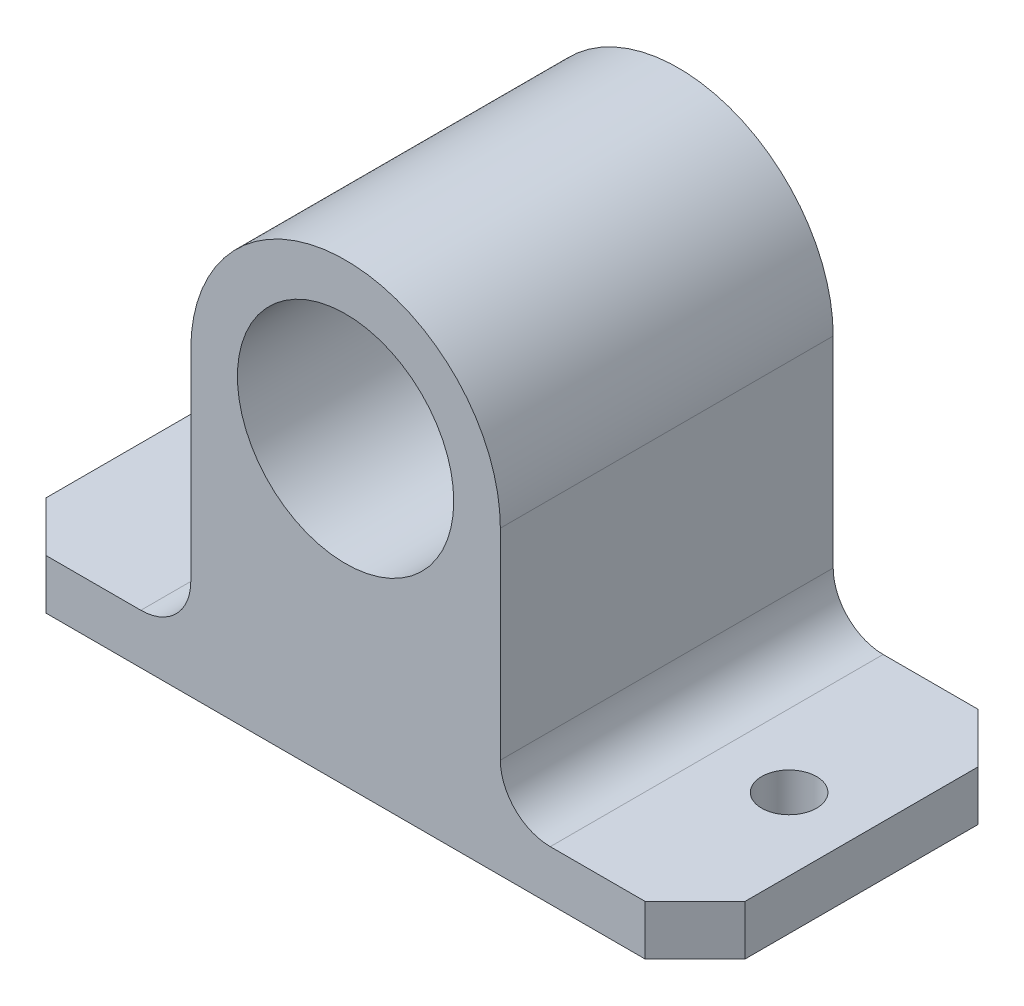
ISO-10303-21;
HEADER;
FILE_DESCRIPTION(('STEP AP214'),'2;1');
FILE_NAME('part.step','',(''),(''),'','','');
FILE_SCHEMA(('AUTOMOTIVE_DESIGN { 1 0 10303 214 1 1 1 1 }'));
ENDSEC;
DATA;
#1=APPLICATION_CONTEXT('core data for automotive mechanical design processes');
#2=APPLICATION_PROTOCOL_DEFINITION('international standard','automotive_design',2000,#1);
#3=PRODUCT_CONTEXT('',#1,'mechanical');
#4=PRODUCT('Part','Part','',(#3));
#5=PRODUCT_RELATED_PRODUCT_CATEGORY('part','',(#4));
#6=PRODUCT_DEFINITION_FORMATION('','',#4);
#7=PRODUCT_DEFINITION_CONTEXT('part definition',#1,'design');
#8=PRODUCT_DEFINITION('design','',#6,#7);
#9=PRODUCT_DEFINITION_SHAPE('','',#8);
#10=(LENGTH_UNIT() NAMED_UNIT(*) SI_UNIT(.MILLI.,.METRE.));
#11=(NAMED_UNIT(*) PLANE_ANGLE_UNIT() SI_UNIT($,.RADIAN.));
#12=(NAMED_UNIT(*) SI_UNIT($,.STERADIAN.) SOLID_ANGLE_UNIT());
#13=UNCERTAINTY_MEASURE_WITH_UNIT(LENGTH_MEASURE(1.E-05),#10,'distance_accuracy_value','');
#14=(GEOMETRIC_REPRESENTATION_CONTEXT(3) GLOBAL_UNCERTAINTY_ASSIGNED_CONTEXT((#13)) GLOBAL_UNIT_ASSIGNED_CONTEXT((#10,
#11,#12)) REPRESENTATION_CONTEXT('',''));
#15=CARTESIAN_POINT('',(0.,0.,0.));
#16=DIRECTION('',(0.,0.,1.));
#17=DIRECTION('',(1.,0.,0.));
#18=AXIS2_PLACEMENT_3D('',#15,#16,#17);
#19=CARTESIAN_POINT('',(-12.3,-12.0723673279713,20.));
#20=DIRECTION('',(0.,0.,-1.));
#21=DIRECTION('',(-1.,0.,0.));
#22=AXIS2_PLACEMENT_3D('',#19,#20,#21);
#23=PLANE('',#22);
#24=DIRECTION('',(-1.,0.,0.));
#25=VECTOR('',#24,1.);
#26=CARTESIAN_POINT('',(-21.,-15.0723673279713,20.));
#27=LINE('',#26,#25);
#28=CARTESIAN_POINT('',(-12.3,-15.0723673279713,20.));
#29=VERTEX_POINT('',#28);
#30=CARTESIAN_POINT('',(-18.,-15.0723673279713,20.));
#31=VERTEX_POINT('',#30);
#32=EDGE_CURVE('E185',#29,#31,#27,.T.);
#33=ORIENTED_EDGE('',*,*,#32,.T.);
#34=DIRECTION('',(0.,-1.,0.));
#35=VECTOR('',#34,1.);
#36=CARTESIAN_POINT('',(-18.,-12.0723673279713,20.));
#37=LINE('',#36,#35);
#38=CARTESIAN_POINT('',(-18.,-18.0723673279713,20.));
#39=VERTEX_POINT('',#38);
#40=EDGE_CURVE('E248',#31,#39,#37,.T.);
#41=ORIENTED_EDGE('',*,*,#40,.T.);
#42=DIRECTION('',(1.,0.,0.));
#43=VECTOR('',#42,1.);
#44=CARTESIAN_POINT('',(-21.,-18.0723673279713,20.));
#45=LINE('',#44,#43);
#46=CARTESIAN_POINT('',(18.,-18.0723673279713,20.));
#47=VERTEX_POINT('',#46);
#48=EDGE_CURVE('E153',#39,#47,#45,.T.);
#49=ORIENTED_EDGE('',*,*,#48,.T.);
#50=DIRECTION('',(0.,1.,0.));
#51=VECTOR('',#50,1.);
#52=CARTESIAN_POINT('',(18.,-12.0723673279713,20.));
#53=LINE('',#52,#51);
#54=CARTESIAN_POINT('',(18.,-15.0723673279713,20.));
#55=VERTEX_POINT('',#54);
#56=EDGE_CURVE('E151',#47,#55,#53,.T.);
#57=ORIENTED_EDGE('',*,*,#56,.T.);
#58=DIRECTION('',(-1.,0.,0.));
#59=VECTOR('',#58,1.);
#60=CARTESIAN_POINT('',(12.3,-15.0723673279713,20.));
#61=LINE('',#60,#59);
#62=CARTESIAN_POINT('',(12.3,-15.0723673279713,20.));
#63=VERTEX_POINT('',#62);
#64=EDGE_CURVE('E142',#55,#63,#61,.T.);
#65=ORIENTED_EDGE('',*,*,#64,.T.);
#66=CARTESIAN_POINT('',(12.3,-12.0723673279713,20.));
#67=DIRECTION('',(0.,0.,-1.));
#68=DIRECTION('',(-1.,0.,0.));
#69=AXIS2_PLACEMENT_3D('',#66,#67,#68);
#70=CIRCLE('',#69,3.);
#71=CARTESIAN_POINT('',(9.3,-12.0723673279713,20.));
#72=VERTEX_POINT('',#71);
#73=EDGE_CURVE('E147',#63,#72,#70,.T.);
#74=ORIENTED_EDGE('',*,*,#73,.T.);
#75=DIRECTION('',(0.,1.,0.));
#76=VECTOR('',#75,1.);
#77=CARTESIAN_POINT('',(9.3,0.,20.));
#78=LINE('',#77,#76);
#79=CARTESIAN_POINT('',(9.3,0.,20.));
#80=VERTEX_POINT('',#79);
#81=EDGE_CURVE('E170',#72,#80,#78,.T.);
#82=ORIENTED_EDGE('',*,*,#81,.T.);
#83=CARTESIAN_POINT('',(0.,0.,20.));
#84=DIRECTION('',(0.,0.,1.));
#85=DIRECTION('',(1.,0.,0.));
#86=AXIS2_PLACEMENT_3D('',#83,#84,#85);
#87=CIRCLE('',#86,9.3);
#88=CARTESIAN_POINT('',(-9.3,0.,20.));
#89=VERTEX_POINT('',#88);
#90=EDGE_CURVE('E173',#80,#89,#87,.T.);
#91=ORIENTED_EDGE('',*,*,#90,.T.);
#92=DIRECTION('',(0.,-1.,0.));
#93=VECTOR('',#92,1.);
#94=CARTESIAN_POINT('',(-9.3,0.,20.));
#95=LINE('',#94,#93);
#96=CARTESIAN_POINT('',(-9.3,-12.0723673279713,20.));
#97=VERTEX_POINT('',#96);
#98=EDGE_CURVE('E179',#89,#97,#95,.T.);
#99=ORIENTED_EDGE('',*,*,#98,.T.);
#100=CARTESIAN_POINT('',(-12.3,-12.0723673279713,20.));
#101=DIRECTION('',(0.,0.,-1.));
#102=DIRECTION('',(-1.,0.,0.));
#103=AXIS2_PLACEMENT_3D('',#100,#101,#102);
#104=CIRCLE('',#103,3.);
#105=EDGE_CURVE('E182',#97,#29,#104,.T.);
#106=ORIENTED_EDGE('',*,*,#105,.T.);
#107=EDGE_LOOP('',(#33,#41,#49,#57,#65,#74,#82,#91,#99,#106));
#108=FACE_BOUND('',#107,.T.);
#109=CARTESIAN_POINT('',(0.,0.,20.));
#110=DIRECTION('',(0.,0.,1.));
#111=DIRECTION('',(1.,0.,0.));
#112=AXIS2_PLACEMENT_3D('',#109,#110,#111);
#113=CIRCLE('',#112,6.5);
#114=CARTESIAN_POINT('',(6.5,0.,20.));
#115=VERTEX_POINT('',#114);
#116=EDGE_CURVE('E193',#115,#115,#113,.T.);
#117=ORIENTED_EDGE('',*,*,#116,.F.);
#118=EDGE_LOOP('',(#117));
#119=FACE_BOUND('',#118,.T.);
#120=ADVANCED_FACE('F41',(#108,#119),#23,.F.);
#121=CARTESIAN_POINT('',(-12.3,-12.0723673279713,0.));
#122=DIRECTION('',(0.,0.,-1.));
#123=DIRECTION('',(-1.,0.,0.));
#124=AXIS2_PLACEMENT_3D('',#121,#122,#123);
#125=PLANE('',#124);
#126=DIRECTION('',(1.,0.,0.));
#127=VECTOR('',#126,1.);
#128=CARTESIAN_POINT('',(-21.,-18.0723673279713,0.));
#129=LINE('',#128,#127);
#130=CARTESIAN_POINT('',(-18.,-18.0723673279713,0.));
#131=VERTEX_POINT('',#130);
#132=CARTESIAN_POINT('',(18.,-18.0723673279713,0.));
#133=VERTEX_POINT('',#132);
#134=EDGE_CURVE('E189',#131,#133,#129,.T.);
#135=ORIENTED_EDGE('',*,*,#134,.F.);
#136=DIRECTION('',(0.,1.,0.));
#137=VECTOR('',#136,1.);
#138=CARTESIAN_POINT('',(-18.,-15.0723673279713,0.));
#139=LINE('',#138,#137);
#140=CARTESIAN_POINT('',(-18.,-15.0723673279713,0.));
#141=VERTEX_POINT('',#140);
#142=EDGE_CURVE('E280',#131,#141,#139,.T.);
#143=ORIENTED_EDGE('',*,*,#142,.T.);
#144=DIRECTION('',(-1.,0.,0.));
#145=VECTOR('',#144,1.);
#146=CARTESIAN_POINT('',(-21.,-15.0723673279713,0.));
#147=LINE('',#146,#145);
#148=CARTESIAN_POINT('',(-12.3,-15.0723673279713,0.));
#149=VERTEX_POINT('',#148);
#150=EDGE_CURVE('E211',#149,#141,#147,.T.);
#151=ORIENTED_EDGE('',*,*,#150,.F.);
#152=CARTESIAN_POINT('',(-12.3,-12.0723673279713,0.));
#153=DIRECTION('',(0.,0.,-1.));
#154=DIRECTION('',(-1.,0.,0.));
#155=AXIS2_PLACEMENT_3D('',#152,#153,#154);
#156=CIRCLE('',#155,3.);
#157=CARTESIAN_POINT('',(-9.3,-12.0723673279713,0.));
#158=VERTEX_POINT('',#157);
#159=EDGE_CURVE('E208',#158,#149,#156,.T.);
#160=ORIENTED_EDGE('',*,*,#159,.F.);
#161=DIRECTION('',(0.,-1.,0.));
#162=VECTOR('',#161,1.);
#163=CARTESIAN_POINT('',(-9.3,0.,0.));
#164=LINE('',#163,#162);
#165=CARTESIAN_POINT('',(-9.3,0.,0.));
#166=VERTEX_POINT('',#165);
#167=EDGE_CURVE('E205',#166,#158,#164,.T.);
#168=ORIENTED_EDGE('',*,*,#167,.F.);
#169=CARTESIAN_POINT('',(0.,0.,0.));
#170=DIRECTION('',(0.,0.,1.));
#171=DIRECTION('',(1.,0.,0.));
#172=AXIS2_PLACEMENT_3D('',#169,#170,#171);
#173=CIRCLE('',#172,9.3);
#174=CARTESIAN_POINT('',(9.3,0.,0.));
#175=VERTEX_POINT('',#174);
#176=EDGE_CURVE('E202',#175,#166,#173,.T.);
#177=ORIENTED_EDGE('',*,*,#176,.F.);
#178=DIRECTION('',(0.,1.,0.));
#179=VECTOR('',#178,1.);
#180=CARTESIAN_POINT('',(9.3,0.,0.));
#181=LINE('',#180,#179);
#182=CARTESIAN_POINT('',(9.3,-12.0723673279713,0.));
#183=VERTEX_POINT('',#182);
#184=EDGE_CURVE('E199',#183,#175,#181,.T.);
#185=ORIENTED_EDGE('',*,*,#184,.F.);
#186=CARTESIAN_POINT('',(12.3,-12.0723673279713,0.));
#187=DIRECTION('',(0.,0.,-1.));
#188=DIRECTION('',(-1.,0.,0.));
#189=AXIS2_PLACEMENT_3D('',#186,#187,#188);
#190=CIRCLE('',#189,3.);
#191=CARTESIAN_POINT('',(12.3,-15.0723673279713,0.));
#192=VERTEX_POINT('',#191);
#193=EDGE_CURVE('E196',#192,#183,#190,.T.);
#194=ORIENTED_EDGE('',*,*,#193,.F.);
#195=DIRECTION('',(-1.,0.,0.));
#196=VECTOR('',#195,1.);
#197=CARTESIAN_POINT('',(12.3,-15.0723673279713,0.));
#198=LINE('',#197,#196);
#199=CARTESIAN_POINT('',(18.,-15.0723673279713,0.));
#200=VERTEX_POINT('',#199);
#201=EDGE_CURVE('E159',#200,#192,#198,.T.);
#202=ORIENTED_EDGE('',*,*,#201,.F.);
#203=DIRECTION('',(0.,-1.,0.));
#204=VECTOR('',#203,1.);
#205=CARTESIAN_POINT('',(18.,-18.0723673279713,0.));
#206=LINE('',#205,#204);
#207=EDGE_CURVE('E277',#200,#133,#206,.T.);
#208=ORIENTED_EDGE('',*,*,#207,.T.);
#209=EDGE_LOOP('',(#135,#143,#151,#160,#168,#177,#185,#194,#202,#208));
#210=FACE_BOUND('',#209,.T.);
#211=CARTESIAN_POINT('',(0.,0.,0.));
#212=DIRECTION('',(0.,0.,1.));
#213=DIRECTION('',(1.,0.,0.));
#214=AXIS2_PLACEMENT_3D('',#211,#212,#213);
#215=CIRCLE('',#214,6.5);
#216=CARTESIAN_POINT('',(6.5,0.,0.));
#217=VERTEX_POINT('',#216);
#218=EDGE_CURVE('E524',#217,#217,#215,.T.);
#219=ORIENTED_EDGE('',*,*,#218,.T.);
#220=EDGE_LOOP('',(#219));
#221=FACE_BOUND('',#220,.T.);
#222=ADVANCED_FACE('F296',(#210,#221),#125,.T.);
#223=CARTESIAN_POINT('',(-21.,-18.0723673279713,20.));
#224=DIRECTION('',(1.,0.,0.));
#225=DIRECTION('',(0.,0.,-1.));
#226=AXIS2_PLACEMENT_3D('',#223,#224,#225);
#227=PLANE('',#226);
#228=DIRECTION('',(0.,0.,-1.));
#229=VECTOR('',#228,1.);
#230=CARTESIAN_POINT('',(-21.,-18.0723673279713,20.));
#231=LINE('',#230,#229);
#232=CARTESIAN_POINT('',(-21.,-18.0723673279713,17.));
#233=VERTEX_POINT('',#232);
#234=CARTESIAN_POINT('',(-21.,-18.0723673279713,3.));
#235=VERTEX_POINT('',#234);
#236=EDGE_CURVE('E242',#233,#235,#231,.T.);
#237=ORIENTED_EDGE('',*,*,#236,.F.);
#238=DIRECTION('',(0.,1.,0.));
#239=VECTOR('',#238,1.);
#240=CARTESIAN_POINT('',(-21.,-18.0723673279713,17.));
#241=LINE('',#240,#239);
#242=CARTESIAN_POINT('',(-21.,-15.0723673279713,17.));
#243=VERTEX_POINT('',#242);
#244=EDGE_CURVE('E268',#233,#243,#241,.T.);
#245=ORIENTED_EDGE('',*,*,#244,.T.);
#246=DIRECTION('',(0.,0.,-1.));
#247=VECTOR('',#246,1.);
#248=CARTESIAN_POINT('',(-21.,-15.0723673279713,20.));
#249=LINE('',#248,#247);
#250=CARTESIAN_POINT('',(-21.,-15.0723673279713,3.));
#251=VERTEX_POINT('',#250);
#252=EDGE_CURVE('E188',#243,#251,#249,.T.);
#253=ORIENTED_EDGE('',*,*,#252,.T.);
#254=DIRECTION('',(0.,-1.,0.));
#255=VECTOR('',#254,1.);
#256=CARTESIAN_POINT('',(-21.,-18.0723673279713,3.));
#257=LINE('',#256,#255);
#258=EDGE_CURVE('E264',#251,#235,#257,.T.);
#259=ORIENTED_EDGE('',*,*,#258,.T.);
#260=EDGE_LOOP('',(#237,#245,#253,#259));
#261=FACE_BOUND('',#260,.T.);
#262=ADVANCED_FACE('F316',(#261),#227,.F.);
#263=CARTESIAN_POINT('',(-21.,-18.0723673279713,20.));
#264=DIRECTION('',(0.,1.,0.));
#265=DIRECTION('',(-1.,0.,0.));
#266=AXIS2_PLACEMENT_3D('',#263,#264,#265);
#267=PLANE('',#266);
#268=CARTESIAN_POINT('',(16.65,-18.0723673279713,10.));
#269=DIRECTION('',(0.,1.,0.));
#270=DIRECTION('',(-1.,0.,0.));
#271=AXIS2_PLACEMENT_3D('',#268,#269,#270);
#272=CIRCLE('',#271,1.65);
#273=CARTESIAN_POINT('',(15.,-18.0723673279713,10.));
#274=VERTEX_POINT('',#273);
#275=EDGE_CURVE('E514',#274,#274,#272,.T.);
#276=ORIENTED_EDGE('',*,*,#275,.T.);
#277=EDGE_LOOP('',(#276));
#278=FACE_BOUND('',#277,.T.);
#279=CARTESIAN_POINT('',(-16.65,-18.0723673279713,10.));
#280=DIRECTION('',(0.,1.,0.));
#281=DIRECTION('',(-1.,0.,0.));
#282=AXIS2_PLACEMENT_3D('',#279,#280,#281);
#283=CIRCLE('',#282,1.65);
#284=CARTESIAN_POINT('',(-18.3,-18.0723673279713,10.));
#285=VERTEX_POINT('',#284);
#286=EDGE_CURVE('E517',#285,#285,#283,.T.);
#287=ORIENTED_EDGE('',*,*,#286,.T.);
#288=EDGE_LOOP('',(#287));
#289=FACE_BOUND('',#288,.T.);
#290=ORIENTED_EDGE('',*,*,#48,.F.);
#291=DIRECTION('',(0.707106781186546,0.,0.707106781186549));
#292=VECTOR('',#291,1.);
#293=CARTESIAN_POINT('',(-18.,-18.0723673279713,20.));
#294=LINE('',#293,#292);
#295=EDGE_CURVE('E261',#39,#233,#294,.F.);
#296=ORIENTED_EDGE('',*,*,#295,.T.);
#297=ORIENTED_EDGE('',*,*,#236,.T.);
#298=DIRECTION('',(0.707106781186549,0.,-0.707106781186546));
#299=VECTOR('',#298,1.);
#300=CARTESIAN_POINT('',(-21.,-18.0723673279713,3.));
#301=LINE('',#300,#299);
#302=EDGE_CURVE('E258',#235,#131,#301,.T.);
#303=ORIENTED_EDGE('',*,*,#302,.T.);
#304=ORIENTED_EDGE('',*,*,#134,.T.);
#305=DIRECTION('',(0.707106781186549,0.,0.707106781186546));
#306=VECTOR('',#305,1.);
#307=CARTESIAN_POINT('',(21.,-18.0723673279713,3.));
#308=LINE('',#307,#306);
#309=CARTESIAN_POINT('',(21.,-18.0723673279713,3.));
#310=VERTEX_POINT('',#309);
#311=EDGE_CURVE('E255',#133,#310,#308,.T.);
#312=ORIENTED_EDGE('',*,*,#311,.T.);
#313=DIRECTION('',(0.,0.,-1.));
#314=VECTOR('',#313,1.);
#315=CARTESIAN_POINT('',(21.,-18.0723673279713,20.));
#316=LINE('',#315,#314);
#317=CARTESIAN_POINT('',(21.,-18.0723673279713,17.));
#318=VERTEX_POINT('',#317);
#319=EDGE_CURVE('E238',#318,#310,#316,.T.);
#320=ORIENTED_EDGE('',*,*,#319,.F.);
#321=DIRECTION('',(0.707106781186546,0.,-0.707106781186549));
#322=VECTOR('',#321,1.);
#323=CARTESIAN_POINT('',(18.,-18.0723673279713,20.));
#324=LINE('',#323,#322);
#325=EDGE_CURVE('E252',#318,#47,#324,.F.);
#326=ORIENTED_EDGE('',*,*,#325,.T.);
#327=EDGE_LOOP('',(#290,#296,#297,#303,#304,#312,#320,#326));
#328=FACE_BOUND('',#327,.T.);
#329=ADVANCED_FACE('F302',(#278,#289,#328),#267,.F.);
#330=CARTESIAN_POINT('',(21.,-18.0723673279713,20.));
#331=DIRECTION('',(-1.,0.,0.));
#332=DIRECTION('',(0.,0.,1.));
#333=AXIS2_PLACEMENT_3D('',#330,#331,#332);
#334=PLANE('',#333);
#335=ORIENTED_EDGE('',*,*,#319,.T.);
#336=DIRECTION('',(0.,1.,0.));
#337=VECTOR('',#336,1.);
#338=CARTESIAN_POINT('',(21.,-15.0723673279713,3.));
#339=LINE('',#338,#337);
#340=CARTESIAN_POINT('',(21.,-15.0723673279713,3.));
#341=VERTEX_POINT('',#340);
#342=EDGE_CURVE('E286',#310,#341,#339,.T.);
#343=ORIENTED_EDGE('',*,*,#342,.T.);
#344=DIRECTION('',(0.,0.,-1.));
#345=VECTOR('',#344,1.);
#346=CARTESIAN_POINT('',(21.,-15.0723673279713,20.));
#347=LINE('',#346,#345);
#348=CARTESIAN_POINT('',(21.,-15.0723673279713,17.));
#349=VERTEX_POINT('',#348);
#350=EDGE_CURVE('E163',#349,#341,#347,.T.);
#351=ORIENTED_EDGE('',*,*,#350,.F.);
#352=DIRECTION('',(0.,-1.,0.));
#353=VECTOR('',#352,1.);
#354=CARTESIAN_POINT('',(21.,-18.0723673279713,17.));
#355=LINE('',#354,#353);
#356=EDGE_CURVE('E283',#349,#318,#355,.T.);
#357=ORIENTED_EDGE('',*,*,#356,.T.);
#358=EDGE_LOOP('',(#335,#343,#351,#357));
#359=FACE_BOUND('',#358,.T.);
#360=ADVANCED_FACE('F290',(#359),#334,.F.);
#361=CARTESIAN_POINT('',(12.3,-15.0723673279713,20.));
#362=DIRECTION('',(0.,-1.,0.));
#363=DIRECTION('',(1.,0.,0.));
#364=AXIS2_PLACEMENT_3D('',#361,#362,#363);
#365=PLANE('',#364);
#366=CARTESIAN_POINT('',(16.65,-15.0723673279713,10.));
#367=DIRECTION('',(0.,1.,0.));
#368=DIRECTION('',(-1.,0.,0.));
#369=AXIS2_PLACEMENT_3D('',#366,#367,#368);
#370=CIRCLE('',#369,1.65);
#371=CARTESIAN_POINT('',(15.,-15.0723673279713,10.));
#372=VERTEX_POINT('',#371);
#373=EDGE_CURVE('E520',#372,#372,#370,.T.);
#374=ORIENTED_EDGE('',*,*,#373,.F.);
#375=EDGE_LOOP('',(#374));
#376=FACE_BOUND('',#375,.T.);
#377=ORIENTED_EDGE('',*,*,#350,.T.);
#378=DIRECTION('',(-0.707106781186549,0.,-0.707106781186546));
#379=VECTOR('',#378,1.);
#380=CARTESIAN_POINT('',(21.,-15.0723673279713,3.));
#381=LINE('',#380,#379);
#382=EDGE_CURVE('E11',#341,#200,#381,.T.);
#383=ORIENTED_EDGE('',*,*,#382,.T.);
#384=ORIENTED_EDGE('',*,*,#201,.T.);
#385=DIRECTION('',(0.,0.,-1.));
#386=VECTOR('',#385,1.);
#387=CARTESIAN_POINT('',(12.3,-15.0723673279713,20.));
#388=LINE('',#387,#386);
#389=EDGE_CURVE('E156',#63,#192,#388,.T.);
#390=ORIENTED_EDGE('',*,*,#389,.F.);
#391=ORIENTED_EDGE('',*,*,#64,.F.);
#392=DIRECTION('',(-0.707106781186546,0.,0.707106781186549));
#393=VECTOR('',#392,1.);
#394=CARTESIAN_POINT('',(18.,-15.0723673279713,20.));
#395=LINE('',#394,#393);
#396=EDGE_CURVE('E51',#55,#349,#395,.F.);
#397=ORIENTED_EDGE('',*,*,#396,.T.);
#398=EDGE_LOOP('',(#377,#383,#384,#390,#391,#397));
#399=FACE_BOUND('',#398,.T.);
#400=ADVANCED_FACE('F157',(#376,#399),#365,.F.);
#401=CARTESIAN_POINT('',(12.3,-12.0723673279713,20.));
#402=DIRECTION('',(0.,0.,-1.));
#403=DIRECTION('',(-1.,0.,0.));
#404=AXIS2_PLACEMENT_3D('',#401,#402,#403);
#405=CYLINDRICAL_SURFACE('',#404,3.);
#406=ORIENTED_EDGE('',*,*,#193,.T.);
#407=DIRECTION('',(0.,0.,-1.));
#408=VECTOR('',#407,1.);
#409=CARTESIAN_POINT('',(9.3,-12.0723673279713,20.));
#410=LINE('',#409,#408);
#411=EDGE_CURVE('E164',#72,#183,#410,.T.);
#412=ORIENTED_EDGE('',*,*,#411,.F.);
#413=ORIENTED_EDGE('',*,*,#73,.F.);
#414=ORIENTED_EDGE('',*,*,#389,.T.);
#415=EDGE_LOOP('',(#406,#412,#413,#414));
#416=FACE_BOUND('',#415,.T.);
#417=ADVANCED_FACE('F166',(#416),#405,.F.);
#418=CARTESIAN_POINT('',(9.3,0.,20.));
#419=DIRECTION('',(-1.,0.,0.));
#420=DIRECTION('',(0.,-1.,0.));
#421=AXIS2_PLACEMENT_3D('',#418,#419,#420);
#422=PLANE('',#421);
#423=ORIENTED_EDGE('',*,*,#184,.T.);
#424=DIRECTION('',(0.,0.,-1.));
#425=VECTOR('',#424,1.);
#426=CARTESIAN_POINT('',(9.3,0.,20.));
#427=LINE('',#426,#425);
#428=EDGE_CURVE('E230',#80,#175,#427,.T.);
#429=ORIENTED_EDGE('',*,*,#428,.F.);
#430=ORIENTED_EDGE('',*,*,#81,.F.);
#431=ORIENTED_EDGE('',*,*,#411,.T.);
#432=EDGE_LOOP('',(#423,#429,#430,#431));
#433=FACE_BOUND('',#432,.T.);
#434=ADVANCED_FACE('F339',(#433),#422,.F.);
#435=CARTESIAN_POINT('',(0.,0.,20.));
#436=DIRECTION('',(0.,0.,-1.));
#437=DIRECTION('',(-1.,0.,0.));
#438=AXIS2_PLACEMENT_3D('',#435,#436,#437);
#439=CYLINDRICAL_SURFACE('',#438,9.3);
#440=ORIENTED_EDGE('',*,*,#176,.T.);
#441=DIRECTION('',(0.,0.,-1.));
#442=VECTOR('',#441,1.);
#443=CARTESIAN_POINT('',(-9.3,0.,20.));
#444=LINE('',#443,#442);
#445=EDGE_CURVE('E226',#89,#166,#444,.T.);
#446=ORIENTED_EDGE('',*,*,#445,.F.);
#447=ORIENTED_EDGE('',*,*,#90,.F.);
#448=ORIENTED_EDGE('',*,*,#428,.T.);
#449=EDGE_LOOP('',(#440,#446,#447,#448));
#450=FACE_BOUND('',#449,.T.);
#451=ADVANCED_FACE('F336',(#450),#439,.T.);
#452=CARTESIAN_POINT('',(-9.3,0.,20.));
#453=DIRECTION('',(1.,0.,0.));
#454=DIRECTION('',(0.,1.,0.));
#455=AXIS2_PLACEMENT_3D('',#452,#453,#454);
#456=PLANE('',#455);
#457=ORIENTED_EDGE('',*,*,#167,.T.);
#458=DIRECTION('',(0.,0.,-1.));
#459=VECTOR('',#458,1.);
#460=CARTESIAN_POINT('',(-9.3,-12.0723673279713,20.));
#461=LINE('',#460,#459);
#462=EDGE_CURVE('E222',#97,#158,#461,.T.);
#463=ORIENTED_EDGE('',*,*,#462,.F.);
#464=ORIENTED_EDGE('',*,*,#98,.F.);
#465=ORIENTED_EDGE('',*,*,#445,.T.);
#466=EDGE_LOOP('',(#457,#463,#464,#465));
#467=FACE_BOUND('',#466,.T.);
#468=ADVANCED_FACE('F332',(#467),#456,.F.);
#469=CARTESIAN_POINT('',(-12.3,-12.0723673279713,20.));
#470=DIRECTION('',(0.,0.,-1.));
#471=DIRECTION('',(-1.,0.,0.));
#472=AXIS2_PLACEMENT_3D('',#469,#470,#471);
#473=CYLINDRICAL_SURFACE('',#472,3.);
#474=ORIENTED_EDGE('',*,*,#159,.T.);
#475=DIRECTION('',(0.,0.,-1.));
#476=VECTOR('',#475,1.);
#477=CARTESIAN_POINT('',(-12.3,-15.0723673279713,20.));
#478=LINE('',#477,#476);
#479=EDGE_CURVE('E218',#29,#149,#478,.T.);
#480=ORIENTED_EDGE('',*,*,#479,.F.);
#481=ORIENTED_EDGE('',*,*,#105,.F.);
#482=ORIENTED_EDGE('',*,*,#462,.T.);
#483=EDGE_LOOP('',(#474,#480,#481,#482));
#484=FACE_BOUND('',#483,.T.);
#485=ADVANCED_FACE('F327',(#484),#473,.F.);
#486=CARTESIAN_POINT('',(-21.,-15.0723673279713,20.));
#487=DIRECTION('',(0.,-1.,0.));
#488=DIRECTION('',(0.,0.,-1.));
#489=AXIS2_PLACEMENT_3D('',#486,#487,#488);
#490=PLANE('',#489);
#491=CARTESIAN_POINT('',(-16.65,-15.0723673279713,10.));
#492=DIRECTION('',(0.,1.,0.));
#493=DIRECTION('',(-1.,0.,0.));
#494=AXIS2_PLACEMENT_3D('',#491,#492,#493);
#495=CIRCLE('',#494,1.65);
#496=CARTESIAN_POINT('',(-18.3,-15.0723673279713,10.));
#497=VERTEX_POINT('',#496);
#498=EDGE_CURVE('E527',#497,#497,#495,.T.);
#499=ORIENTED_EDGE('',*,*,#498,.F.);
#500=EDGE_LOOP('',(#499));
#501=FACE_BOUND('',#500,.T.);
#502=ORIENTED_EDGE('',*,*,#252,.F.);
#503=DIRECTION('',(-0.707106781186546,0.,-0.707106781186549));
#504=VECTOR('',#503,1.);
#505=CARTESIAN_POINT('',(-18.,-15.0723673279713,20.));
#506=LINE('',#505,#504);
#507=EDGE_CURVE('E274',#243,#31,#506,.F.);
#508=ORIENTED_EDGE('',*,*,#507,.T.);
#509=ORIENTED_EDGE('',*,*,#32,.F.);
#510=ORIENTED_EDGE('',*,*,#479,.T.);
#511=ORIENTED_EDGE('',*,*,#150,.T.);
#512=DIRECTION('',(-0.707106781186549,0.,0.707106781186546));
#513=VECTOR('',#512,1.);
#514=CARTESIAN_POINT('',(-21.,-15.0723673279713,3.));
#515=LINE('',#514,#513);
#516=EDGE_CURVE('E271',#141,#251,#515,.T.);
#517=ORIENTED_EDGE('',*,*,#516,.T.);
#518=EDGE_LOOP('',(#502,#508,#509,#510,#511,#517));
#519=FACE_BOUND('',#518,.T.);
#520=ADVANCED_FACE('F312',(#501,#519),#490,.F.);
#521=CARTESIAN_POINT('',(0.,0.,20.));
#522=DIRECTION('',(0.,0.,-1.));
#523=DIRECTION('',(-1.,0.,0.));
#524=AXIS2_PLACEMENT_3D('',#521,#522,#523);
#525=CYLINDRICAL_SURFACE('',#524,6.5);
#526=ORIENTED_EDGE('',*,*,#116,.T.);
#527=EDGE_LOOP('',(#526));
#528=FACE_BOUND('',#527,.T.);
#529=ORIENTED_EDGE('',*,*,#218,.F.);
#530=EDGE_LOOP('',(#529));
#531=FACE_BOUND('',#530,.T.);
#532=ADVANCED_FACE('F355',(#528,#531),#525,.F.);
#533=CARTESIAN_POINT('',(-18.,-12.0723673279713,20.));
#534=DIRECTION('',(0.707106781186549,0.,-0.707106781186546));
#535=DIRECTION('',(0.,-1.,0.));
#536=AXIS2_PLACEMENT_3D('',#533,#534,#535);
#537=PLANE('',#536);
#538=ORIENTED_EDGE('',*,*,#507,.F.);
#539=ORIENTED_EDGE('',*,*,#244,.F.);
#540=ORIENTED_EDGE('',*,*,#295,.F.);
#541=ORIENTED_EDGE('',*,*,#40,.F.);
#542=EDGE_LOOP('',(#538,#539,#540,#541));
#543=FACE_BOUND('',#542,.T.);
#544=ADVANCED_FACE('F319',(#543),#537,.F.);
#545=CARTESIAN_POINT('',(-21.,-18.0723673279713,3.));
#546=DIRECTION('',(-0.707106781186546,0.,-0.707106781186549));
#547=DIRECTION('',(0.,1.,0.));
#548=AXIS2_PLACEMENT_3D('',#545,#546,#547);
#549=PLANE('',#548);
#550=ORIENTED_EDGE('',*,*,#516,.F.);
#551=ORIENTED_EDGE('',*,*,#142,.F.);
#552=ORIENTED_EDGE('',*,*,#302,.F.);
#553=ORIENTED_EDGE('',*,*,#258,.F.);
#554=EDGE_LOOP('',(#550,#551,#552,#553));
#555=FACE_BOUND('',#554,.T.);
#556=ADVANCED_FACE('F308',(#555),#549,.T.);
#557=CARTESIAN_POINT('',(21.,-18.0723673279713,3.));
#558=DIRECTION('',(0.707106781186546,0.,-0.707106781186549));
#559=DIRECTION('',(0.,-1.,0.));
#560=AXIS2_PLACEMENT_3D('',#557,#558,#559);
#561=PLANE('',#560);
#562=ORIENTED_EDGE('',*,*,#311,.F.);
#563=ORIENTED_EDGE('',*,*,#207,.F.);
#564=ORIENTED_EDGE('',*,*,#382,.F.);
#565=ORIENTED_EDGE('',*,*,#342,.F.);
#566=EDGE_LOOP('',(#562,#563,#564,#565));
#567=FACE_BOUND('',#566,.T.);
#568=ADVANCED_FACE('F299',(#567),#561,.T.);
#569=CARTESIAN_POINT('',(18.,-12.0723673279713,20.));
#570=DIRECTION('',(-0.707106781186549,0.,-0.707106781186546));
#571=DIRECTION('',(0.,1.,0.));
#572=AXIS2_PLACEMENT_3D('',#569,#570,#571);
#573=PLANE('',#572);
#574=ORIENTED_EDGE('',*,*,#325,.F.);
#575=ORIENTED_EDGE('',*,*,#356,.F.);
#576=ORIENTED_EDGE('',*,*,#396,.F.);
#577=ORIENTED_EDGE('',*,*,#56,.F.);
#578=EDGE_LOOP('',(#574,#575,#576,#577));
#579=FACE_BOUND('',#578,.T.);
#580=ADVANCED_FACE('F44',(#579),#573,.F.);
#581=CARTESIAN_POINT('',(-16.65,-35.0723673279713,10.));
#582=DIRECTION('',(0.,1.,0.));
#583=DIRECTION('',(-1.,0.,0.));
#584=AXIS2_PLACEMENT_3D('',#581,#582,#583);
#585=CYLINDRICAL_SURFACE('',#584,1.65);
#586=ORIENTED_EDGE('',*,*,#498,.T.);
#587=EDGE_LOOP('',(#586));
#588=FACE_BOUND('',#587,.T.);
#589=ORIENTED_EDGE('',*,*,#286,.F.);
#590=EDGE_LOOP('',(#589));
#591=FACE_BOUND('',#590,.T.);
#592=ADVANCED_FACE('F408',(#588,#591),#585,.F.);
#593=CARTESIAN_POINT('',(16.65,-35.0723673279713,10.));
#594=DIRECTION('',(0.,1.,0.));
#595=DIRECTION('',(-1.,0.,0.));
#596=AXIS2_PLACEMENT_3D('',#593,#594,#595);
#597=CYLINDRICAL_SURFACE('',#596,1.65);
#598=ORIENTED_EDGE('',*,*,#373,.T.);
#599=EDGE_LOOP('',(#598));
#600=FACE_BOUND('',#599,.T.);
#601=ORIENTED_EDGE('',*,*,#275,.F.);
#602=EDGE_LOOP('',(#601));
#603=FACE_BOUND('',#602,.T.);
#604=ADVANCED_FACE('F415',(#600,#603),#597,.F.);
#605=CLOSED_SHELL('',(#120,#222,#262,#329,#360,#400,#417,#434,#451,#468,#485,#520,#532,#544,
#556,#568,#580,#592,#604));
#606=MANIFOLD_SOLID_BREP('B2',#605);
#607=ADVANCED_BREP_SHAPE_REPRESENTATION('',(#18,#606),#14);
#608=SHAPE_DEFINITION_REPRESENTATION(#9,#607);
ENDSEC;
END-ISO-10303-21;
